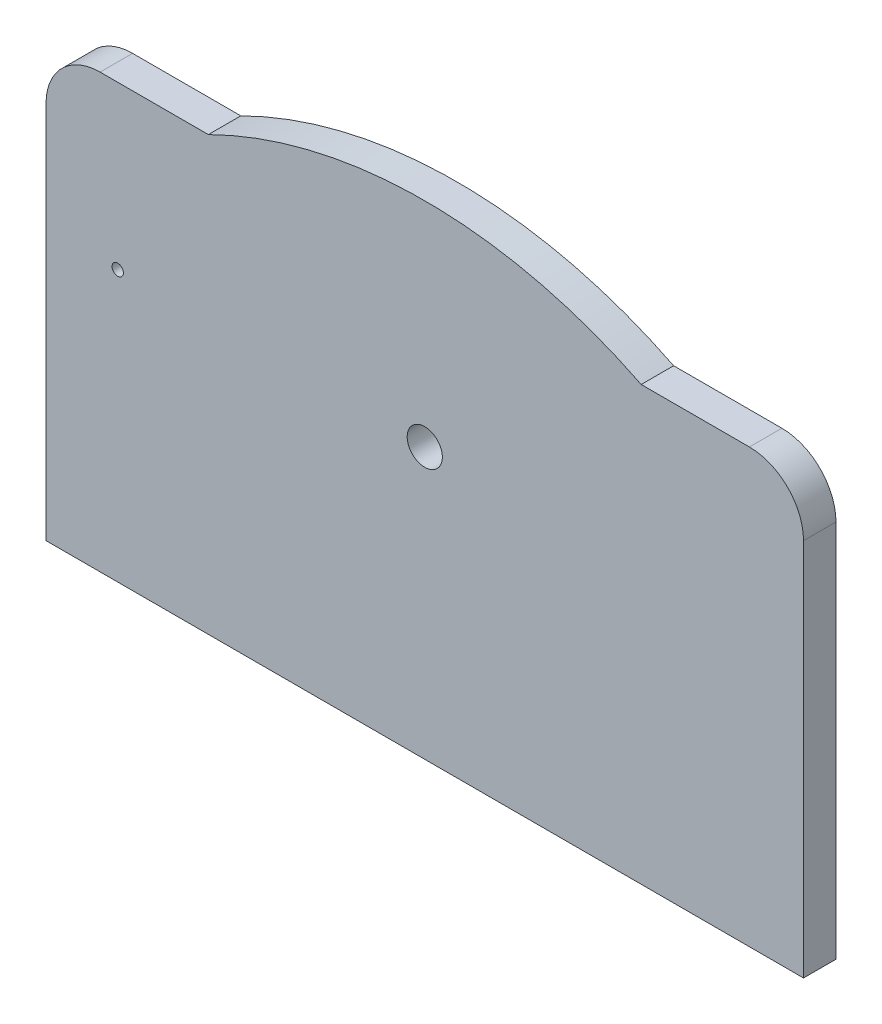
ISO-10303-21;
HEADER;
FILE_DESCRIPTION(('STEP AP214'),'2;1');
FILE_NAME('part.step','',(''),(''),'','','');
FILE_SCHEMA(('AUTOMOTIVE_DESIGN { 1 0 10303 214 1 1 1 1 }'));
ENDSEC;
DATA;
#1=APPLICATION_CONTEXT('core data for automotive mechanical design processes');
#2=APPLICATION_PROTOCOL_DEFINITION('international standard','automotive_design',2000,#1);
#3=PRODUCT_CONTEXT('',#1,'mechanical');
#4=PRODUCT('Part','Part','',(#3));
#5=PRODUCT_RELATED_PRODUCT_CATEGORY('part','',(#4));
#6=PRODUCT_DEFINITION_FORMATION('','',#4);
#7=PRODUCT_DEFINITION_CONTEXT('part definition',#1,'design');
#8=PRODUCT_DEFINITION('design','',#6,#7);
#9=PRODUCT_DEFINITION_SHAPE('','',#8);
#10=(LENGTH_UNIT() NAMED_UNIT(*) SI_UNIT(.MILLI.,.METRE.));
#11=(NAMED_UNIT(*) PLANE_ANGLE_UNIT() SI_UNIT($,.RADIAN.));
#12=(NAMED_UNIT(*) SI_UNIT($,.STERADIAN.) SOLID_ANGLE_UNIT());
#13=UNCERTAINTY_MEASURE_WITH_UNIT(LENGTH_MEASURE(1.E-05),#10,'distance_accuracy_value','');
#14=(GEOMETRIC_REPRESENTATION_CONTEXT(3) GLOBAL_UNCERTAINTY_ASSIGNED_CONTEXT((#13)) GLOBAL_UNIT_ASSIGNED_CONTEXT((#10,
#11,#12)) REPRESENTATION_CONTEXT('',''));
#15=CARTESIAN_POINT('',(0.,0.,0.));
#16=DIRECTION('',(0.,0.,1.));
#17=DIRECTION('',(1.,0.,0.));
#18=AXIS2_PLACEMENT_3D('',#15,#16,#17);
#19=CARTESIAN_POINT('',(-60.,40.,6.));
#20=DIRECTION('',(0.,-1.,0.));
#21=DIRECTION('',(0.,0.,-1.));
#22=AXIS2_PLACEMENT_3D('',#19,#20,#21);
#23=PLANE('',#22);
#24=DIRECTION('',(-1.,0.,0.));
#25=VECTOR('',#24,1.);
#26=CARTESIAN_POINT('',(-60.,40.,6.));
#27=LINE('',#26,#25);
#28=CARTESIAN_POINT('',(-30.,40.,6.));
#29=VERTEX_POINT('',#28);
#30=CARTESIAN_POINT('',(-50.,40.,6.));
#31=VERTEX_POINT('',#30);
#32=EDGE_CURVE('E46',#29,#31,#27,.T.);
#33=ORIENTED_EDGE('',*,*,#32,.F.);
#34=DIRECTION('',(0.,0.,-1.));
#35=VECTOR('',#34,1.);
#36=CARTESIAN_POINT('',(-30.,40.,6.));
#37=LINE('',#36,#35);
#38=CARTESIAN_POINT('',(-30.,40.,0.));
#39=VERTEX_POINT('',#38);
#40=EDGE_CURVE('E108',#29,#39,#37,.T.);
#41=ORIENTED_EDGE('',*,*,#40,.T.);
#42=DIRECTION('',(-1.,0.,0.));
#43=VECTOR('',#42,1.);
#44=CARTESIAN_POINT('',(-60.,40.,0.));
#45=LINE('',#44,#43);
#46=CARTESIAN_POINT('',(-50.,40.,0.));
#47=VERTEX_POINT('',#46);
#48=EDGE_CURVE('E97',#39,#47,#45,.T.);
#49=ORIENTED_EDGE('',*,*,#48,.T.);
#50=DIRECTION('',(0.,0.,-1.));
#51=VECTOR('',#50,1.);
#52=CARTESIAN_POINT('',(-50.,40.,6.));
#53=LINE('',#52,#51);
#54=EDGE_CURVE('E172',#47,#31,#53,.F.);
#55=ORIENTED_EDGE('',*,*,#54,.T.);
#56=EDGE_LOOP('',(#33,#41,#49,#55));
#57=FACE_BOUND('',#56,.T.);
#58=ADVANCED_FACE('F31',(#57),#23,.F.);
#59=CARTESIAN_POINT('',(-60.,40.,6.));
#60=DIRECTION('',(1.,0.,0.));
#61=DIRECTION('',(0.,0.,-1.));
#62=AXIS2_PLACEMENT_3D('',#59,#60,#61);
#63=PLANE('',#62);
#64=DIRECTION('',(0.,-1.,0.));
#65=VECTOR('',#64,1.);
#66=CARTESIAN_POINT('',(-60.,40.,6.));
#67=LINE('',#66,#65);
#68=CARTESIAN_POINT('',(-60.,30.,6.));
#69=VERTEX_POINT('',#68);
#70=CARTESIAN_POINT('',(-60.,-40.,6.));
#71=VERTEX_POINT('',#70);
#72=EDGE_CURVE('E148',#69,#71,#67,.T.);
#73=ORIENTED_EDGE('',*,*,#72,.F.);
#74=DIRECTION('',(0.,0.,-1.));
#75=VECTOR('',#74,1.);
#76=CARTESIAN_POINT('',(-60.,30.,6.));
#77=LINE('',#76,#75);
#78=CARTESIAN_POINT('',(-60.,30.,0.));
#79=VERTEX_POINT('',#78);
#80=EDGE_CURVE('E163',#69,#79,#77,.T.);
#81=ORIENTED_EDGE('',*,*,#80,.T.);
#82=DIRECTION('',(0.,-1.,0.));
#83=VECTOR('',#82,1.);
#84=CARTESIAN_POINT('',(-60.,40.,0.));
#85=LINE('',#84,#83);
#86=CARTESIAN_POINT('',(-60.,-40.,0.));
#87=VERTEX_POINT('',#86);
#88=EDGE_CURVE('E142',#79,#87,#85,.T.);
#89=ORIENTED_EDGE('',*,*,#88,.T.);
#90=DIRECTION('',(0.,0.,-1.));
#91=VECTOR('',#90,1.);
#92=CARTESIAN_POINT('',(-60.,-40.,6.));
#93=LINE('',#92,#91);
#94=EDGE_CURVE('E160',#71,#87,#93,.T.);
#95=ORIENTED_EDGE('',*,*,#94,.F.);
#96=EDGE_LOOP('',(#73,#81,#89,#95));
#97=FACE_BOUND('',#96,.T.);
#98=ADVANCED_FACE('F33',(#97),#63,.F.);
#99=CARTESIAN_POINT('',(-60.,-40.,6.));
#100=DIRECTION('',(0.,1.,0.));
#101=DIRECTION('',(0.,0.,1.));
#102=AXIS2_PLACEMENT_3D('',#99,#100,#101);
#103=PLANE('',#102);
#104=DIRECTION('',(1.,0.,0.));
#105=VECTOR('',#104,1.);
#106=CARTESIAN_POINT('',(-60.,-40.,0.));
#107=LINE('',#106,#105);
#108=CARTESIAN_POINT('',(80.,-40.,0.));
#109=VERTEX_POINT('',#108);
#110=EDGE_CURVE('E144',#87,#109,#107,.T.);
#111=ORIENTED_EDGE('',*,*,#110,.T.);
#112=DIRECTION('',(0.,0.,-1.));
#113=VECTOR('',#112,1.);
#114=CARTESIAN_POINT('',(80.,-40.,6.));
#115=LINE('',#114,#113);
#116=CARTESIAN_POINT('',(80.,-40.,6.));
#117=VERTEX_POINT('',#116);
#118=EDGE_CURVE('E157',#117,#109,#115,.T.);
#119=ORIENTED_EDGE('',*,*,#118,.F.);
#120=DIRECTION('',(1.,0.,0.));
#121=VECTOR('',#120,1.);
#122=CARTESIAN_POINT('',(-60.,-40.,6.));
#123=LINE('',#122,#121);
#124=EDGE_CURVE('E150',#71,#117,#123,.T.);
#125=ORIENTED_EDGE('',*,*,#124,.F.);
#126=ORIENTED_EDGE('',*,*,#94,.T.);
#127=EDGE_LOOP('',(#111,#119,#125,#126));
#128=FACE_BOUND('',#127,.T.);
#129=ADVANCED_FACE('F203',(#128),#103,.F.);
#130=CARTESIAN_POINT('',(80.,40.,6.));
#131=DIRECTION('',(-1.,0.,0.));
#132=DIRECTION('',(0.,-1.,0.));
#133=AXIS2_PLACEMENT_3D('',#130,#131,#132);
#134=PLANE('',#133);
#135=DIRECTION('',(0.,1.,0.));
#136=VECTOR('',#135,1.);
#137=CARTESIAN_POINT('',(80.,40.,0.));
#138=LINE('',#137,#136);
#139=CARTESIAN_POINT('',(80.,30.,0.));
#140=VERTEX_POINT('',#139);
#141=EDGE_CURVE('E106',#109,#140,#138,.T.);
#142=ORIENTED_EDGE('',*,*,#141,.T.);
#143=DIRECTION('',(0.,0.,-1.));
#144=VECTOR('',#143,1.);
#145=CARTESIAN_POINT('',(80.,30.,6.));
#146=LINE('',#145,#144);
#147=CARTESIAN_POINT('',(80.,30.,6.));
#148=VERTEX_POINT('',#147);
#149=EDGE_CURVE('E11',#140,#148,#146,.F.);
#150=ORIENTED_EDGE('',*,*,#149,.T.);
#151=DIRECTION('',(0.,1.,0.));
#152=VECTOR('',#151,1.);
#153=CARTESIAN_POINT('',(80.,40.,6.));
#154=LINE('',#153,#152);
#155=EDGE_CURVE('E152',#117,#148,#154,.T.);
#156=ORIENTED_EDGE('',*,*,#155,.F.);
#157=ORIENTED_EDGE('',*,*,#118,.T.);
#158=EDGE_LOOP('',(#142,#150,#156,#157));
#159=FACE_BOUND('',#158,.T.);
#160=ADVANCED_FACE('F207',(#159),#134,.F.);
#161=CARTESIAN_POINT('',(70.,40.,0.));
#162=VERTEX_POINT('',#161);
#163=CARTESIAN_POINT('',(50.,40.,0.));
#164=VERTEX_POINT('',#163);
#165=EDGE_CURVE('E105',#162,#164,#45,.T.);
#166=ORIENTED_EDGE('',*,*,#165,.T.);
#167=DIRECTION('',(0.,0.,-1.));
#168=VECTOR('',#167,1.);
#169=CARTESIAN_POINT('',(50.,40.,6.));
#170=LINE('',#169,#168);
#171=CARTESIAN_POINT('',(50.,40.,6.));
#172=VERTEX_POINT('',#171);
#173=EDGE_CURVE('E54',#172,#164,#170,.T.);
#174=ORIENTED_EDGE('',*,*,#173,.F.);
#175=CARTESIAN_POINT('',(70.,40.,6.));
#176=VERTEX_POINT('',#175);
#177=EDGE_CURVE('E155',#176,#172,#27,.T.);
#178=ORIENTED_EDGE('',*,*,#177,.F.);
#179=DIRECTION('',(0.,0.,-1.));
#180=VECTOR('',#179,1.);
#181=CARTESIAN_POINT('',(70.,40.,6.));
#182=LINE('',#181,#180);
#183=EDGE_CURVE('E169',#176,#162,#182,.T.);
#184=ORIENTED_EDGE('',*,*,#183,.T.);
#185=EDGE_LOOP('',(#166,#174,#178,#184));
#186=FACE_BOUND('',#185,.T.);
#187=ADVANCED_FACE('F199',(#186),#23,.F.);
#188=CARTESIAN_POINT('',(-60.,-40.,6.));
#189=DIRECTION('',(0.,0.,1.));
#190=DIRECTION('',(1.,0.,0.));
#191=AXIS2_PLACEMENT_3D('',#188,#189,#190);
#192=PLANE('',#191);
#193=CARTESIAN_POINT('',(-46.75,10.,6.));
#194=DIRECTION('',(0.,0.,-1.));
#195=DIRECTION('',(-1.,0.,0.));
#196=AXIS2_PLACEMENT_3D('',#193,#194,#195);
#197=CIRCLE('',#196,1.05);
#198=CARTESIAN_POINT('',(-47.8,10.,6.));
#199=VERTEX_POINT('',#198);
#200=EDGE_CURVE('E116',#199,#199,#197,.T.);
#201=ORIENTED_EDGE('',*,*,#200,.T.);
#202=EDGE_LOOP('',(#201));
#203=FACE_BOUND('',#202,.T.);
#204=CARTESIAN_POINT('',(10.,10.,6.));
#205=DIRECTION('',(0.,0.,1.));
#206=DIRECTION('',(1.,0.,0.));
#207=AXIS2_PLACEMENT_3D('',#204,#205,#206);
#208=CIRCLE('',#207,3.25);
#209=CARTESIAN_POINT('',(13.25,10.,6.));
#210=VERTEX_POINT('',#209);
#211=EDGE_CURVE('E136',#210,#210,#208,.T.);
#212=ORIENTED_EDGE('',*,*,#211,.F.);
#213=EDGE_LOOP('',(#212));
#214=FACE_BOUND('',#213,.T.);
#215=ORIENTED_EDGE('',*,*,#177,.T.);
#216=CARTESIAN_POINT('',(10.,-40.2366607135671,6.));
#217=DIRECTION('',(0.,0.,-1.));
#218=DIRECTION('',(-1.,0.,0.));
#219=AXIS2_PLACEMENT_3D('',#216,#217,#218);
#220=CIRCLE('',#219,89.6544573485562);
#221=EDGE_CURVE('E115',#29,#172,#220,.T.);
#222=ORIENTED_EDGE('',*,*,#221,.F.);
#223=ORIENTED_EDGE('',*,*,#32,.T.);
#224=CARTESIAN_POINT('',(-50.,30.,6.));
#225=DIRECTION('',(0.,0.,1.));
#226=DIRECTION('',(1.,0.,0.));
#227=AXIS2_PLACEMENT_3D('',#224,#225,#226);
#228=CIRCLE('',#227,10.);
#229=EDGE_CURVE('E39',#31,#69,#228,.T.);
#230=ORIENTED_EDGE('',*,*,#229,.T.);
#231=ORIENTED_EDGE('',*,*,#72,.T.);
#232=ORIENTED_EDGE('',*,*,#124,.T.);
#233=ORIENTED_EDGE('',*,*,#155,.T.);
#234=CARTESIAN_POINT('',(70.,30.,6.));
#235=DIRECTION('',(0.,0.,1.));
#236=DIRECTION('',(1.,0.,0.));
#237=AXIS2_PLACEMENT_3D('',#234,#235,#236);
#238=CIRCLE('',#237,10.);
#239=EDGE_CURVE('E174',#148,#176,#238,.T.);
#240=ORIENTED_EDGE('',*,*,#239,.T.);
#241=EDGE_LOOP('',(#215,#222,#223,#230,#231,#232,#233,#240));
#242=FACE_BOUND('',#241,.T.);
#243=ADVANCED_FACE('F178',(#203,#214,#242),#192,.T.);
#244=CARTESIAN_POINT('',(-60.,-40.,0.));
#245=DIRECTION('',(0.,0.,1.));
#246=DIRECTION('',(1.,0.,0.));
#247=AXIS2_PLACEMENT_3D('',#244,#245,#246);
#248=PLANE('',#247);
#249=CARTESIAN_POINT('',(-46.75,10.,0.));
#250=DIRECTION('',(0.,0.,-1.));
#251=DIRECTION('',(-1.,0.,0.));
#252=AXIS2_PLACEMENT_3D('',#249,#250,#251);
#253=CIRCLE('',#252,1.05);
#254=CARTESIAN_POINT('',(-47.8,10.,0.));
#255=VERTEX_POINT('',#254);
#256=EDGE_CURVE('E120',#255,#255,#253,.T.);
#257=ORIENTED_EDGE('',*,*,#256,.F.);
#258=EDGE_LOOP('',(#257));
#259=FACE_BOUND('',#258,.T.);
#260=CARTESIAN_POINT('',(-19.77,5.30000000000001,0.));
#261=DIRECTION('',(0.,0.,-1.));
#262=DIRECTION('',(-1.,0.,0.));
#263=AXIS2_PLACEMENT_3D('',#260,#261,#262);
#264=CIRCLE('',#263,1.05);
#265=CARTESIAN_POINT('',(-20.82,5.30000000000001,0.));
#266=VERTEX_POINT('',#265);
#267=EDGE_CURVE('E112',#266,#266,#264,.T.);
#268=ORIENTED_EDGE('',*,*,#267,.F.);
#269=EDGE_LOOP('',(#268));
#270=FACE_BOUND('',#269,.T.);
#271=CARTESIAN_POINT('',(-19.77,14.8,0.));
#272=DIRECTION('',(0.,0.,-1.));
#273=DIRECTION('',(-1.,0.,0.));
#274=AXIS2_PLACEMENT_3D('',#271,#272,#273);
#275=CIRCLE('',#274,1.05);
#276=CARTESIAN_POINT('',(-20.82,14.8,0.));
#277=VERTEX_POINT('',#276);
#278=EDGE_CURVE('E130',#277,#277,#275,.T.);
#279=ORIENTED_EDGE('',*,*,#278,.F.);
#280=EDGE_LOOP('',(#279));
#281=FACE_BOUND('',#280,.T.);
#282=CARTESIAN_POINT('',(10.,10.,0.));
#283=DIRECTION('',(0.,0.,1.));
#284=DIRECTION('',(1.,0.,0.));
#285=AXIS2_PLACEMENT_3D('',#282,#283,#284);
#286=CIRCLE('',#285,3.25);
#287=CARTESIAN_POINT('',(13.25,10.,0.));
#288=VERTEX_POINT('',#287);
#289=EDGE_CURVE('E139',#288,#288,#286,.T.);
#290=ORIENTED_EDGE('',*,*,#289,.T.);
#291=EDGE_LOOP('',(#290));
#292=FACE_BOUND('',#291,.T.);
#293=ORIENTED_EDGE('',*,*,#88,.F.);
#294=CARTESIAN_POINT('',(-50.,30.,0.));
#295=DIRECTION('',(0.,0.,1.));
#296=DIRECTION('',(1.,0.,0.));
#297=AXIS2_PLACEMENT_3D('',#294,#295,#296);
#298=CIRCLE('',#297,10.);
#299=EDGE_CURVE('E103',#79,#47,#298,.F.);
#300=ORIENTED_EDGE('',*,*,#299,.T.);
#301=ORIENTED_EDGE('',*,*,#48,.F.);
#302=CARTESIAN_POINT('',(10.,-40.2366607135671,0.));
#303=DIRECTION('',(0.,0.,-1.));
#304=DIRECTION('',(-1.,0.,0.));
#305=AXIS2_PLACEMENT_3D('',#302,#303,#304);
#306=CIRCLE('',#305,89.6544573485562);
#307=EDGE_CURVE('E102',#39,#164,#306,.T.);
#308=ORIENTED_EDGE('',*,*,#307,.T.);
#309=ORIENTED_EDGE('',*,*,#165,.F.);
#310=CARTESIAN_POINT('',(70.,30.,0.));
#311=DIRECTION('',(0.,0.,1.));
#312=DIRECTION('',(1.,0.,0.));
#313=AXIS2_PLACEMENT_3D('',#310,#311,#312);
#314=CIRCLE('',#313,10.);
#315=EDGE_CURVE('E166',#162,#140,#314,.F.);
#316=ORIENTED_EDGE('',*,*,#315,.T.);
#317=ORIENTED_EDGE('',*,*,#141,.F.);
#318=ORIENTED_EDGE('',*,*,#110,.F.);
#319=EDGE_LOOP('',(#293,#300,#301,#308,#309,#316,#317,#318));
#320=FACE_BOUND('',#319,.T.);
#321=ADVANCED_FACE('F99',(#259,#270,#281,#292,#320),#248,.F.);
#322=CARTESIAN_POINT('',(-50.,30.,6.));
#323=DIRECTION('',(0.,0.,-1.));
#324=DIRECTION('',(-1.,0.,0.));
#325=AXIS2_PLACEMENT_3D('',#322,#323,#324);
#326=CYLINDRICAL_SURFACE('',#325,10.);
#327=ORIENTED_EDGE('',*,*,#229,.F.);
#328=ORIENTED_EDGE('',*,*,#54,.F.);
#329=ORIENTED_EDGE('',*,*,#299,.F.);
#330=ORIENTED_EDGE('',*,*,#80,.F.);
#331=EDGE_LOOP('',(#327,#328,#329,#330));
#332=FACE_BOUND('',#331,.T.);
#333=ADVANCED_FACE('F184',(#332),#326,.T.);
#334=CARTESIAN_POINT('',(70.,30.,6.));
#335=DIRECTION('',(0.,0.,-1.));
#336=DIRECTION('',(-1.,0.,0.));
#337=AXIS2_PLACEMENT_3D('',#334,#335,#336);
#338=CYLINDRICAL_SURFACE('',#337,10.);
#339=ORIENTED_EDGE('',*,*,#239,.F.);
#340=ORIENTED_EDGE('',*,*,#149,.F.);
#341=ORIENTED_EDGE('',*,*,#315,.F.);
#342=ORIENTED_EDGE('',*,*,#183,.F.);
#343=EDGE_LOOP('',(#339,#340,#341,#342));
#344=FACE_BOUND('',#343,.T.);
#345=ADVANCED_FACE('F186',(#344),#338,.T.);
#346=CARTESIAN_POINT('',(10.,10.,0.));
#347=DIRECTION('',(0.,0.,1.));
#348=DIRECTION('',(1.,0.,0.));
#349=AXIS2_PLACEMENT_3D('',#346,#347,#348);
#350=CYLINDRICAL_SURFACE('',#349,3.25);
#351=ORIENTED_EDGE('',*,*,#289,.F.);
#352=EDGE_LOOP('',(#351));
#353=FACE_BOUND('',#352,.T.);
#354=ORIENTED_EDGE('',*,*,#211,.T.);
#355=EDGE_LOOP('',(#354));
#356=FACE_BOUND('',#355,.T.);
#357=ADVANCED_FACE('F192',(#353,#356),#350,.F.);
#358=CARTESIAN_POINT('',(-19.77,14.8,1.));
#359=DIRECTION('',(0.,0.,-1.));
#360=DIRECTION('',(-1.,0.,0.));
#361=AXIS2_PLACEMENT_3D('',#358,#359,#360);
#362=CYLINDRICAL_SURFACE('',#361,1.05);
#363=CARTESIAN_POINT('',(-19.77,14.8,1.));
#364=DIRECTION('',(0.,0.,-1.));
#365=DIRECTION('',(-1.,0.,0.));
#366=AXIS2_PLACEMENT_3D('',#363,#364,#365);
#367=CIRCLE('',#366,1.05);
#368=CARTESIAN_POINT('',(-20.82,14.8,1.));
#369=VERTEX_POINT('',#368);
#370=EDGE_CURVE('E133',#369,#369,#367,.T.);
#371=ORIENTED_EDGE('',*,*,#370,.F.);
#372=EDGE_LOOP('',(#371));
#373=FACE_BOUND('',#372,.T.);
#374=ORIENTED_EDGE('',*,*,#278,.T.);
#375=EDGE_LOOP('',(#374));
#376=FACE_BOUND('',#375,.T.);
#377=ADVANCED_FACE('F254',(#373,#376),#362,.F.);
#378=CARTESIAN_POINT('',(-19.77,14.8,1.));
#379=DIRECTION('',(0.,0.,-1.));
#380=DIRECTION('',(-1.,0.,0.));
#381=AXIS2_PLACEMENT_3D('',#378,#379,#380);
#382=PLANE('',#381);
#383=ORIENTED_EDGE('',*,*,#370,.T.);
#384=EDGE_LOOP('',(#383));
#385=FACE_BOUND('',#384,.T.);
#386=ADVANCED_FACE('F264',(#385),#382,.T.);
#387=CARTESIAN_POINT('',(-19.77,5.30000000000001,1.));
#388=DIRECTION('',(0.,0.,-1.));
#389=DIRECTION('',(-1.,0.,0.));
#390=AXIS2_PLACEMENT_3D('',#387,#388,#389);
#391=CYLINDRICAL_SURFACE('',#390,1.05);
#392=CARTESIAN_POINT('',(-19.77,5.30000000000001,1.));
#393=DIRECTION('',(0.,0.,-1.));
#394=DIRECTION('',(-1.,0.,0.));
#395=AXIS2_PLACEMENT_3D('',#392,#393,#394);
#396=CIRCLE('',#395,1.05);
#397=CARTESIAN_POINT('',(-20.82,5.30000000000001,1.));
#398=VERTEX_POINT('',#397);
#399=EDGE_CURVE('E127',#398,#398,#396,.T.);
#400=ORIENTED_EDGE('',*,*,#399,.F.);
#401=EDGE_LOOP('',(#400));
#402=FACE_BOUND('',#401,.T.);
#403=ORIENTED_EDGE('',*,*,#267,.T.);
#404=EDGE_LOOP('',(#403));
#405=FACE_BOUND('',#404,.T.);
#406=ADVANCED_FACE('F274',(#402,#405),#391,.F.);
#407=CARTESIAN_POINT('',(-19.77,5.30000000000001,1.));
#408=DIRECTION('',(0.,0.,-1.));
#409=DIRECTION('',(-1.,0.,0.));
#410=AXIS2_PLACEMENT_3D('',#407,#408,#409);
#411=PLANE('',#410);
#412=ORIENTED_EDGE('',*,*,#399,.T.);
#413=EDGE_LOOP('',(#412));
#414=FACE_BOUND('',#413,.T.);
#415=ADVANCED_FACE('F284',(#414),#411,.T.);
#416=CARTESIAN_POINT('',(10.,-40.2366607135671,6.));
#417=DIRECTION('',(0.,0.,-1.));
#418=DIRECTION('',(-1.,0.,0.));
#419=AXIS2_PLACEMENT_3D('',#416,#417,#418);
#420=CYLINDRICAL_SURFACE('',#419,89.6544573485562);
#421=ORIENTED_EDGE('',*,*,#307,.F.);
#422=ORIENTED_EDGE('',*,*,#40,.F.);
#423=ORIENTED_EDGE('',*,*,#221,.T.);
#424=ORIENTED_EDGE('',*,*,#173,.T.);
#425=EDGE_LOOP('',(#421,#422,#423,#424));
#426=FACE_BOUND('',#425,.T.);
#427=ADVANCED_FACE('F114',(#426),#420,.T.);
#428=CARTESIAN_POINT('',(-46.75,10.,6.));
#429=DIRECTION('',(0.,0.,-1.));
#430=DIRECTION('',(-1.,0.,0.));
#431=AXIS2_PLACEMENT_3D('',#428,#429,#430);
#432=CYLINDRICAL_SURFACE('',#431,1.05);
#433=ORIENTED_EDGE('',*,*,#200,.F.);
#434=EDGE_LOOP('',(#433));
#435=FACE_BOUND('',#434,.T.);
#436=ORIENTED_EDGE('',*,*,#256,.T.);
#437=EDGE_LOOP('',(#436));
#438=FACE_BOUND('',#437,.T.);
#439=ADVANCED_FACE('F312',(#435,#438),#432,.F.);
#440=CLOSED_SHELL('',(#58,#98,#129,#160,#187,#243,#321,#333,#345,#357,#377,#386,#406,#415,#427,#439));
#441=MANIFOLD_SOLID_BREP('B2',#440);
#442=ADVANCED_BREP_SHAPE_REPRESENTATION('',(#18,#441),#14);
#443=SHAPE_DEFINITION_REPRESENTATION(#9,#442);
ENDSEC;
END-ISO-10303-21;
